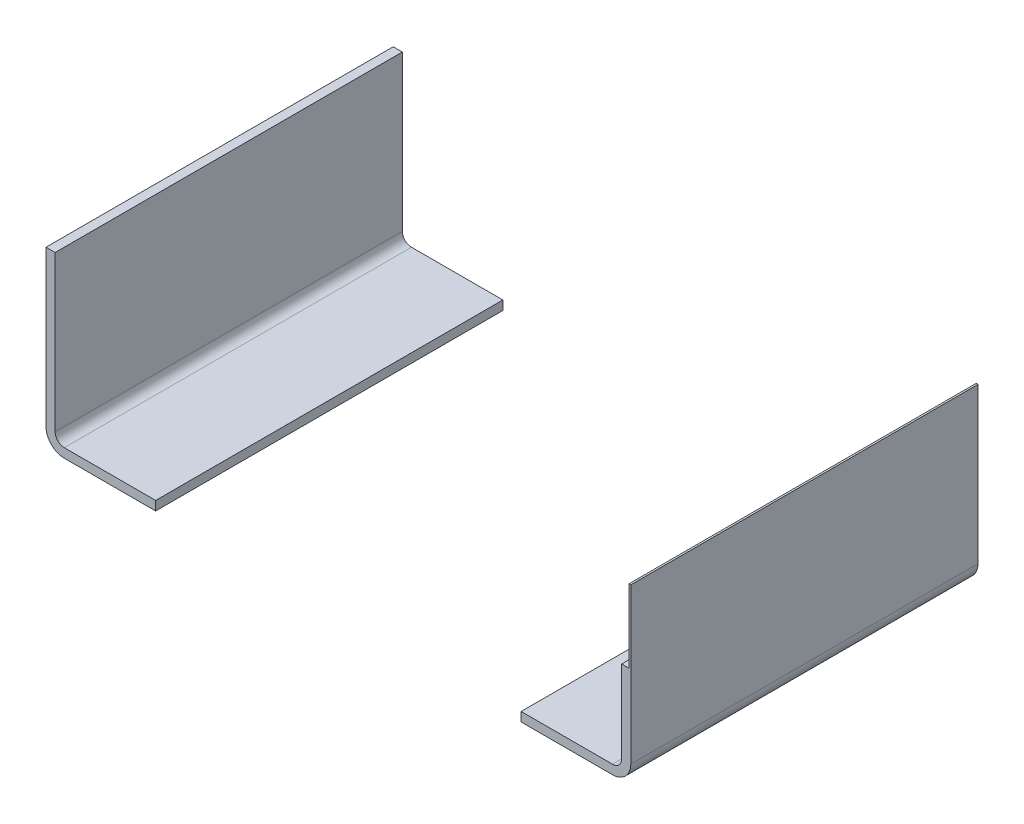
ISO-10303-21;
HEADER;
FILE_DESCRIPTION(('STEP AP214'),'2;1');
FILE_NAME('part.step','',(''),(''),'','','');
FILE_SCHEMA(('AUTOMOTIVE_DESIGN { 1 0 10303 214 1 1 1 1 }'));
ENDSEC;
DATA;
#1=APPLICATION_CONTEXT('core data for automotive mechanical design processes');
#2=APPLICATION_PROTOCOL_DEFINITION('international standard','automotive_design',2000,#1);
#3=PRODUCT_CONTEXT('',#1,'mechanical');
#4=PRODUCT('Part','Part','',(#3));
#5=PRODUCT_RELATED_PRODUCT_CATEGORY('part','',(#4));
#6=PRODUCT_DEFINITION_FORMATION('','',#4);
#7=PRODUCT_DEFINITION_CONTEXT('part definition',#1,'design');
#8=PRODUCT_DEFINITION('design','',#6,#7);
#9=PRODUCT_DEFINITION_SHAPE('','',#8);
#10=(LENGTH_UNIT() NAMED_UNIT(*) SI_UNIT(.MILLI.,.METRE.));
#11=(NAMED_UNIT(*) PLANE_ANGLE_UNIT() SI_UNIT($,.RADIAN.));
#12=(NAMED_UNIT(*) SI_UNIT($,.STERADIAN.) SOLID_ANGLE_UNIT());
#13=UNCERTAINTY_MEASURE_WITH_UNIT(LENGTH_MEASURE(1.E-05),#10,'distance_accuracy_value','');
#14=(GEOMETRIC_REPRESENTATION_CONTEXT(3) GLOBAL_UNCERTAINTY_ASSIGNED_CONTEXT((#13)) GLOBAL_UNIT_ASSIGNED_CONTEXT((#10,
#11,#12)) REPRESENTATION_CONTEXT('',''));
#15=CARTESIAN_POINT('',(0.,0.,0.));
#16=DIRECTION('',(0.,0.,1.));
#17=DIRECTION('',(1.,0.,0.));
#18=AXIS2_PLACEMENT_3D('',#15,#16,#17);
#19=CARTESIAN_POINT('',(1.6,0.95,0.95));
#20=DIRECTION('',(0.,0.,-1.));
#21=DIRECTION('',(-1.,0.,0.));
#22=AXIS2_PLACEMENT_3D('',#19,#20,#21);
#23=PLANE('',#22);
#24=DIRECTION('',(1.,0.,0.));
#25=VECTOR('',#24,1.);
#26=CARTESIAN_POINT('',(1.6,0.55,0.95));
#27=LINE('',#26,#25);
#28=CARTESIAN_POINT('',(1.55,0.55,0.95));
#29=VERTEX_POINT('',#28);
#30=CARTESIAN_POINT('',(1.59,0.55,0.95));
#31=VERTEX_POINT('',#30);
#32=EDGE_CURVE('P0_E198',#29,#31,#27,.T.);
#33=ORIENTED_EDGE('',*,*,#32,.F.);
#34=DIRECTION('',(0.,1.,0.));
#35=VECTOR('',#34,1.);
#36=CARTESIAN_POINT('',(1.55,0.95,0.95));
#37=LINE('',#36,#35);
#38=CARTESIAN_POINT('',(1.55,0.1,0.95));
#39=VERTEX_POINT('',#38);
#40=EDGE_CURVE('P0_E176',#29,#39,#37,.F.);
#41=ORIENTED_EDGE('',*,*,#40,.T.);
#42=CARTESIAN_POINT('',(1.5,0.1,0.95));
#43=DIRECTION('',(0.,0.,1.));
#44=DIRECTION('',(1.,0.,0.));
#45=AXIS2_PLACEMENT_3D('',#42,#43,#44);
#46=CIRCLE('',#45,0.0499999999999999);
#47=CARTESIAN_POINT('',(1.5,0.0500000000000001,0.95));
#48=VERTEX_POINT('',#47);
#49=EDGE_CURVE('P0_E125',#39,#48,#46,.F.);
#50=ORIENTED_EDGE('',*,*,#49,.T.);
#51=DIRECTION('',(-1.,0.,0.));
#52=VECTOR('',#51,1.);
#53=CARTESIAN_POINT('',(1.6,0.05,0.95));
#54=LINE('',#53,#52);
#55=CARTESIAN_POINT('',(1.,0.05,0.95));
#56=VERTEX_POINT('',#55);
#57=EDGE_CURVE('P0_E126',#56,#48,#54,.F.);
#58=ORIENTED_EDGE('',*,*,#57,.F.);
#59=DIRECTION('',(0.,1.,0.));
#60=VECTOR('',#59,1.);
#61=CARTESIAN_POINT('',(1.,0.,0.95));
#62=LINE('',#61,#60);
#63=CARTESIAN_POINT('',(1.,0.,0.95));
#64=VERTEX_POINT('',#63);
#65=EDGE_CURVE('P0_E102',#64,#56,#62,.T.);
#66=ORIENTED_EDGE('',*,*,#65,.F.);
#67=DIRECTION('',(1.,0.,0.));
#68=VECTOR('',#67,1.);
#69=CARTESIAN_POINT('',(1.5,0.,0.95));
#70=LINE('',#69,#68);
#71=CARTESIAN_POINT('',(1.5,0.,0.95));
#72=VERTEX_POINT('',#71);
#73=EDGE_CURVE('P0_E84',#64,#72,#70,.T.);
#74=ORIENTED_EDGE('',*,*,#73,.T.);
#75=CARTESIAN_POINT('',(1.5,0.1,0.95));
#76=DIRECTION('',(0.,0.,1.));
#77=DIRECTION('',(1.,0.,0.));
#78=AXIS2_PLACEMENT_3D('',#75,#76,#77);
#79=CIRCLE('',#78,0.1);
#80=CARTESIAN_POINT('',(1.6,0.1,0.95));
#81=VERTEX_POINT('',#80);
#82=EDGE_CURVE('P0_E20',#81,#72,#79,.F.);
#83=ORIENTED_EDGE('',*,*,#82,.F.);
#84=DIRECTION('',(0.,1.,0.));
#85=VECTOR('',#84,1.);
#86=CARTESIAN_POINT('',(1.6,0.95,0.95));
#87=LINE('',#86,#85);
#88=CARTESIAN_POINT('',(1.6,0.95,0.95));
#89=VERTEX_POINT('',#88);
#90=EDGE_CURVE('P0_E148',#81,#89,#87,.T.);
#91=ORIENTED_EDGE('',*,*,#90,.T.);
#92=DIRECTION('',(-1.,0.,0.));
#93=VECTOR('',#92,1.);
#94=CARTESIAN_POINT('',(1.6,0.95,0.95));
#95=LINE('',#94,#93);
#96=CARTESIAN_POINT('',(1.59,0.95,0.95));
#97=VERTEX_POINT('',#96);
#98=EDGE_CURVE('P0_E121',#97,#89,#95,.F.);
#99=ORIENTED_EDGE('',*,*,#98,.F.);
#100=DIRECTION('',(0.,-1.,0.));
#101=VECTOR('',#100,1.);
#102=CARTESIAN_POINT('',(1.59,0.95,0.95));
#103=LINE('',#102,#101);
#104=EDGE_CURVE('P0_E92',#97,#31,#103,.T.);
#105=ORIENTED_EDGE('',*,*,#104,.T.);
#106=EDGE_LOOP('',(#33,#41,#50,#58,#66,#74,#83,#91,#99,#105));
#107=FACE_BOUND('',#106,.T.);
#108=ADVANCED_FACE('P0_F16',(#107),#23,.F.);
#109=CARTESIAN_POINT('',(1.55,0.95,-0.95));
#110=DIRECTION('',(0.,0.,1.));
#111=DIRECTION('',(1.,0.,0.));
#112=AXIS2_PLACEMENT_3D('',#109,#110,#111);
#113=PLANE('',#112);
#114=DIRECTION('',(-1.,0.,0.));
#115=VECTOR('',#114,1.);
#116=CARTESIAN_POINT('',(1.55,0.55,-0.95));
#117=LINE('',#116,#115);
#118=CARTESIAN_POINT('',(1.59,0.55,-0.95));
#119=VERTEX_POINT('',#118);
#120=CARTESIAN_POINT('',(1.55,0.55,-0.95));
#121=VERTEX_POINT('',#120);
#122=EDGE_CURVE('P0_E35',#119,#121,#117,.T.);
#123=ORIENTED_EDGE('',*,*,#122,.F.);
#124=DIRECTION('',(0.,1.,0.));
#125=VECTOR('',#124,1.);
#126=CARTESIAN_POINT('',(1.59,0.95,-0.95));
#127=LINE('',#126,#125);
#128=CARTESIAN_POINT('',(1.59,0.95,-0.95));
#129=VERTEX_POINT('',#128);
#130=EDGE_CURVE('P0_E11',#119,#129,#127,.T.);
#131=ORIENTED_EDGE('',*,*,#130,.T.);
#132=DIRECTION('',(1.,0.,0.));
#133=VECTOR('',#132,1.);
#134=CARTESIAN_POINT('',(1.55,0.95,-0.95));
#135=LINE('',#134,#133);
#136=CARTESIAN_POINT('',(1.6,0.95,-0.95));
#137=VERTEX_POINT('',#136);
#138=EDGE_CURVE('P0_E137',#137,#129,#135,.F.);
#139=ORIENTED_EDGE('',*,*,#138,.F.);
#140=DIRECTION('',(0.,1.,0.));
#141=VECTOR('',#140,1.);
#142=CARTESIAN_POINT('',(1.6,0.95,-0.95));
#143=LINE('',#142,#141);
#144=CARTESIAN_POINT('',(1.6,0.1,-0.95));
#145=VERTEX_POINT('',#144);
#146=EDGE_CURVE('P0_E101',#137,#145,#143,.F.);
#147=ORIENTED_EDGE('',*,*,#146,.T.);
#148=CARTESIAN_POINT('',(1.5,0.1,-0.95));
#149=DIRECTION('',(0.,0.,1.));
#150=DIRECTION('',(1.,0.,0.));
#151=AXIS2_PLACEMENT_3D('',#148,#149,#150);
#152=CIRCLE('',#151,0.1);
#153=CARTESIAN_POINT('',(1.5,0.,-0.95));
#154=VERTEX_POINT('',#153);
#155=EDGE_CURVE('P0_E90',#154,#145,#152,.T.);
#156=ORIENTED_EDGE('',*,*,#155,.F.);
#157=DIRECTION('',(1.,0.,0.));
#158=VECTOR('',#157,1.);
#159=CARTESIAN_POINT('',(1.5,0.,-0.95));
#160=LINE('',#159,#158);
#161=CARTESIAN_POINT('',(1.,0.,-0.95));
#162=VERTEX_POINT('',#161);
#163=EDGE_CURVE('P0_E87',#154,#162,#160,.F.);
#164=ORIENTED_EDGE('',*,*,#163,.T.);
#165=DIRECTION('',(0.,1.,0.));
#166=VECTOR('',#165,1.);
#167=CARTESIAN_POINT('',(1.,0.,-0.95));
#168=LINE('',#167,#166);
#169=CARTESIAN_POINT('',(1.,0.05,-0.95));
#170=VERTEX_POINT('',#169);
#171=EDGE_CURVE('P0_E74',#170,#162,#168,.F.);
#172=ORIENTED_EDGE('',*,*,#171,.F.);
#173=DIRECTION('',(1.,0.,0.));
#174=VECTOR('',#173,1.);
#175=CARTESIAN_POINT('',(1.5,0.05,-0.95));
#176=LINE('',#175,#174);
#177=CARTESIAN_POINT('',(1.5,0.0500000000000001,-0.95));
#178=VERTEX_POINT('',#177);
#179=EDGE_CURVE('P0_E141',#170,#178,#176,.T.);
#180=ORIENTED_EDGE('',*,*,#179,.T.);
#181=CARTESIAN_POINT('',(1.5,0.1,-0.95));
#182=DIRECTION('',(0.,0.,1.));
#183=DIRECTION('',(1.,0.,0.));
#184=AXIS2_PLACEMENT_3D('',#181,#182,#183);
#185=CIRCLE('',#184,0.0499999999999999);
#186=CARTESIAN_POINT('',(1.55,0.1,-0.95));
#187=VERTEX_POINT('',#186);
#188=EDGE_CURVE('P0_E127',#187,#178,#185,.F.);
#189=ORIENTED_EDGE('',*,*,#188,.F.);
#190=DIRECTION('',(0.,1.,0.));
#191=VECTOR('',#190,1.);
#192=CARTESIAN_POINT('',(1.55,0.95,-0.95));
#193=LINE('',#192,#191);
#194=EDGE_CURVE('P0_E119',#187,#121,#193,.T.);
#195=ORIENTED_EDGE('',*,*,#194,.T.);
#196=EDGE_LOOP('',(#123,#131,#139,#147,#156,#164,#172,#180,#189,#195));
#197=FACE_BOUND('',#196,.T.);
#198=ADVANCED_FACE('P0_F88',(#197),#113,.F.);
#199=CARTESIAN_POINT('',(1.55,0.95,1.1));
#200=DIRECTION('',(1.,0.,0.));
#201=DIRECTION('',(0.,0.,-1.));
#202=AXIS2_PLACEMENT_3D('',#199,#200,#201);
#203=PLANE('',#202);
#204=DIRECTION('',(0.,0.,1.));
#205=VECTOR('',#204,1.);
#206=CARTESIAN_POINT('',(1.55,0.55,1.1));
#207=LINE('',#206,#205);
#208=EDGE_CURVE('P0_E26',#121,#29,#207,.T.);
#209=ORIENTED_EDGE('',*,*,#208,.F.);
#210=ORIENTED_EDGE('',*,*,#194,.F.);
#211=DIRECTION('',(0.,0.,-1.));
#212=VECTOR('',#211,1.);
#213=CARTESIAN_POINT('',(1.55,0.1,1.1));
#214=LINE('',#213,#212);
#215=EDGE_CURVE('P0_E182',#39,#187,#214,.T.);
#216=ORIENTED_EDGE('',*,*,#215,.F.);
#217=ORIENTED_EDGE('',*,*,#40,.F.);
#218=EDGE_LOOP('',(#209,#210,#216,#217));
#219=FACE_BOUND('',#218,.T.);
#220=ADVANCED_FACE('P0_F200',(#219),#203,.F.);
#221=CARTESIAN_POINT('',(1.5,0.,0.));
#222=DIRECTION('',(0.,1.,0.));
#223=DIRECTION('',(0.,0.,1.));
#224=AXIS2_PLACEMENT_3D('',#221,#222,#223);
#225=PLANE('',#224);
#226=DIRECTION('',(0.,0.,1.));
#227=VECTOR('',#226,1.);
#228=CARTESIAN_POINT('',(1.,0.,0.));
#229=LINE('',#228,#227);
#230=EDGE_CURVE('P0_E97',#162,#64,#229,.T.);
#231=ORIENTED_EDGE('',*,*,#230,.F.);
#232=ORIENTED_EDGE('',*,*,#163,.F.);
#233=DIRECTION('',(0.,0.,1.));
#234=VECTOR('',#233,1.);
#235=CARTESIAN_POINT('',(1.5,0.,0.55));
#236=LINE('',#235,#234);
#237=EDGE_CURVE('P0_E106',#72,#154,#236,.F.);
#238=ORIENTED_EDGE('',*,*,#237,.F.);
#239=ORIENTED_EDGE('',*,*,#73,.F.);
#240=EDGE_LOOP('',(#231,#232,#238,#239));
#241=FACE_BOUND('',#240,.T.);
#242=ADVANCED_FACE('P0_F18',(#241),#225,.F.);
#243=CARTESIAN_POINT('',(1.5,0.1,0.55));
#244=DIRECTION('',(0.,0.,1.));
#245=DIRECTION('',(1.,0.,0.));
#246=AXIS2_PLACEMENT_3D('',#243,#244,#245);
#247=CYLINDRICAL_SURFACE('',#246,0.1);
#248=ORIENTED_EDGE('',*,*,#237,.T.);
#249=ORIENTED_EDGE('',*,*,#155,.T.);
#250=DIRECTION('',(0.,0.,1.));
#251=VECTOR('',#250,1.);
#252=CARTESIAN_POINT('',(1.6,0.1,0.));
#253=LINE('',#252,#251);
#254=EDGE_CURVE('P0_E109',#145,#81,#253,.T.);
#255=ORIENTED_EDGE('',*,*,#254,.T.);
#256=ORIENTED_EDGE('',*,*,#82,.T.);
#257=EDGE_LOOP('',(#248,#249,#255,#256));
#258=FACE_BOUND('',#257,.T.);
#259=ADVANCED_FACE('P0_F163',(#258),#247,.T.);
#260=CARTESIAN_POINT('',(1.,0.,0.));
#261=DIRECTION('',(-1.,0.,0.));
#262=DIRECTION('',(0.,0.,1.));
#263=AXIS2_PLACEMENT_3D('',#260,#261,#262);
#264=PLANE('',#263);
#265=DIRECTION('',(0.,0.,-1.));
#266=VECTOR('',#265,1.);
#267=CARTESIAN_POINT('',(1.,0.05,1.1));
#268=LINE('',#267,#266);
#269=EDGE_CURVE('P0_E100',#56,#170,#268,.T.);
#270=ORIENTED_EDGE('',*,*,#269,.T.);
#271=ORIENTED_EDGE('',*,*,#171,.T.);
#272=ORIENTED_EDGE('',*,*,#230,.T.);
#273=ORIENTED_EDGE('',*,*,#65,.T.);
#274=EDGE_LOOP('',(#270,#271,#272,#273));
#275=FACE_BOUND('',#274,.T.);
#276=ADVANCED_FACE('P0_F96',(#275),#264,.T.);
#277=CARTESIAN_POINT('',(1.6,0.95,0.));
#278=DIRECTION('',(-1.,0.,0.));
#279=DIRECTION('',(0.,0.,1.));
#280=AXIS2_PLACEMENT_3D('',#277,#278,#279);
#281=PLANE('',#280);
#282=ORIENTED_EDGE('',*,*,#254,.F.);
#283=ORIENTED_EDGE('',*,*,#146,.F.);
#284=DIRECTION('',(0.,0.,-1.));
#285=VECTOR('',#284,1.);
#286=CARTESIAN_POINT('',(1.6,0.95,0.));
#287=LINE('',#286,#285);
#288=EDGE_CURVE('P0_E138',#137,#89,#287,.F.);
#289=ORIENTED_EDGE('',*,*,#288,.T.);
#290=ORIENTED_EDGE('',*,*,#90,.F.);
#291=EDGE_LOOP('',(#282,#283,#289,#290));
#292=FACE_BOUND('',#291,.T.);
#293=ADVANCED_FACE('P0_F166',(#292),#281,.F.);
#294=CARTESIAN_POINT('',(1.5,0.05,1.1));
#295=DIRECTION('',(0.,-1.,0.));
#296=DIRECTION('',(0.,0.,-1.));
#297=AXIS2_PLACEMENT_3D('',#294,#295,#296);
#298=PLANE('',#297);
#299=ORIENTED_EDGE('',*,*,#269,.F.);
#300=ORIENTED_EDGE('',*,*,#57,.T.);
#301=DIRECTION('',(0.,0.,1.));
#302=VECTOR('',#301,1.);
#303=CARTESIAN_POINT('',(1.5,0.0500000000000001,0.));
#304=LINE('',#303,#302);
#305=EDGE_CURVE('P0_E134',#48,#178,#304,.F.);
#306=ORIENTED_EDGE('',*,*,#305,.T.);
#307=ORIENTED_EDGE('',*,*,#179,.F.);
#308=EDGE_LOOP('',(#299,#300,#306,#307));
#309=FACE_BOUND('',#308,.T.);
#310=ADVANCED_FACE('P0_F186',(#309),#298,.F.);
#311=CARTESIAN_POINT('',(1.575,0.95,0.));
#312=DIRECTION('',(0.,-1.,0.));
#313=DIRECTION('',(0.,0.,-1.));
#314=AXIS2_PLACEMENT_3D('',#311,#312,#313);
#315=PLANE('',#314);
#316=ORIENTED_EDGE('',*,*,#138,.T.);
#317=DIRECTION('',(0.,0.,1.));
#318=VECTOR('',#317,1.);
#319=CARTESIAN_POINT('',(1.59,0.95,0.));
#320=LINE('',#319,#318);
#321=EDGE_CURVE('P0_E214',#129,#97,#320,.T.);
#322=ORIENTED_EDGE('',*,*,#321,.T.);
#323=ORIENTED_EDGE('',*,*,#98,.T.);
#324=ORIENTED_EDGE('',*,*,#288,.F.);
#325=EDGE_LOOP('',(#316,#322,#323,#324));
#326=FACE_BOUND('',#325,.T.);
#327=ADVANCED_FACE('P0_F213',(#326),#315,.F.);
#328=CARTESIAN_POINT('',(1.5,0.1,0.));
#329=DIRECTION('',(0.,0.,1.));
#330=DIRECTION('',(1.,0.,0.));
#331=AXIS2_PLACEMENT_3D('',#328,#329,#330);
#332=CYLINDRICAL_SURFACE('',#331,0.0499999999999999);
#333=ORIENTED_EDGE('',*,*,#305,.F.);
#334=ORIENTED_EDGE('',*,*,#49,.F.);
#335=ORIENTED_EDGE('',*,*,#215,.T.);
#336=ORIENTED_EDGE('',*,*,#188,.T.);
#337=EDGE_LOOP('',(#333,#334,#335,#336));
#338=FACE_BOUND('',#337,.T.);
#339=ADVANCED_FACE('P0_F190',(#338),#332,.F.);
#340=CARTESIAN_POINT('',(1.59,0.95,1.4));
#341=DIRECTION('',(1.,0.,0.));
#342=DIRECTION('',(0.,0.,-1.));
#343=AXIS2_PLACEMENT_3D('',#340,#341,#342);
#344=PLANE('',#343);
#345=ORIENTED_EDGE('',*,*,#321,.F.);
#346=ORIENTED_EDGE('',*,*,#130,.F.);
#347=DIRECTION('',(0.,0.,-1.));
#348=VECTOR('',#347,1.);
#349=CARTESIAN_POINT('',(1.59,0.55,1.4));
#350=LINE('',#349,#348);
#351=EDGE_CURVE('P0_E220',#31,#119,#350,.T.);
#352=ORIENTED_EDGE('',*,*,#351,.F.);
#353=ORIENTED_EDGE('',*,*,#104,.F.);
#354=EDGE_LOOP('',(#345,#346,#352,#353));
#355=FACE_BOUND('',#354,.T.);
#356=ADVANCED_FACE('P0_F226',(#355),#344,.F.);
#357=CARTESIAN_POINT('',(0.,0.55,0.));
#358=DIRECTION('',(0.,1.,0.));
#359=DIRECTION('',(0.,0.,1.));
#360=AXIS2_PLACEMENT_3D('',#357,#358,#359);
#361=PLANE('',#360);
#362=ORIENTED_EDGE('',*,*,#32,.T.);
#363=ORIENTED_EDGE('',*,*,#351,.T.);
#364=ORIENTED_EDGE('',*,*,#122,.T.);
#365=ORIENTED_EDGE('',*,*,#208,.T.);
#366=EDGE_LOOP('',(#362,#363,#364,#365));
#367=FACE_BOUND('',#366,.T.);
#368=ADVANCED_FACE('P0_F225',(#367),#361,.T.);
#369=CLOSED_SHELL('',(#108,#198,#220,#242,#259,#276,#293,#310,#327,#339,#356,#368));
#370=MANIFOLD_SOLID_BREP('P0_B1',#369);
#371=CARTESIAN_POINT('',(-1.5,0.,0.));
#372=DIRECTION('',(0.,-1.,0.));
#373=DIRECTION('',(0.,0.,-1.));
#374=AXIS2_PLACEMENT_3D('',#371,#372,#373);
#375=PLANE('',#374);
#376=DIRECTION('',(0.,0.,1.));
#377=VECTOR('',#376,1.);
#378=CARTESIAN_POINT('',(-1.,0.,0.));
#379=LINE('',#378,#377);
#380=CARTESIAN_POINT('',(-1.,0.,-0.95));
#381=VERTEX_POINT('',#380);
#382=CARTESIAN_POINT('',(-1.,0.,0.950000000000001));
#383=VERTEX_POINT('',#382);
#384=EDGE_CURVE('P1_E153',#381,#383,#379,.T.);
#385=ORIENTED_EDGE('',*,*,#384,.T.);
#386=DIRECTION('',(1.,0.,0.));
#387=VECTOR('',#386,1.);
#388=CARTESIAN_POINT('',(-1.5,0.,0.950000000000001));
#389=LINE('',#388,#387);
#390=CARTESIAN_POINT('',(-1.5,0.,0.950000000000001));
#391=VERTEX_POINT('',#390);
#392=EDGE_CURVE('P1_E69',#383,#391,#389,.F.);
#393=ORIENTED_EDGE('',*,*,#392,.T.);
#394=DIRECTION('',(0.,0.,-1.));
#395=VECTOR('',#394,1.);
#396=CARTESIAN_POINT('',(-1.5,0.,0.55));
#397=LINE('',#396,#395);
#398=CARTESIAN_POINT('',(-1.5,0.,-0.95));
#399=VERTEX_POINT('',#398);
#400=EDGE_CURVE('P1_E173',#399,#391,#397,.F.);
#401=ORIENTED_EDGE('',*,*,#400,.F.);
#402=DIRECTION('',(1.,0.,0.));
#403=VECTOR('',#402,1.);
#404=CARTESIAN_POINT('',(-1.5,0.,-0.95));
#405=LINE('',#404,#403);
#406=EDGE_CURVE('P1_E166',#399,#381,#405,.T.);
#407=ORIENTED_EDGE('',*,*,#406,.T.);
#408=EDGE_LOOP('',(#385,#393,#401,#407));
#409=FACE_BOUND('',#408,.T.);
#410=ADVANCED_FACE('P1_F16',(#409),#375,.T.);
#411=CARTESIAN_POINT('',(-1.5,0.1,0.55));
#412=DIRECTION('',(0.,0.,-1.));
#413=DIRECTION('',(-1.,0.,0.));
#414=AXIS2_PLACEMENT_3D('',#411,#412,#413);
#415=CYLINDRICAL_SURFACE('',#414,0.1);
#416=ORIENTED_EDGE('',*,*,#400,.T.);
#417=CARTESIAN_POINT('',(-1.5,0.1,0.950000000000001));
#418=DIRECTION('',(0.,0.,-1.));
#419=DIRECTION('',(-1.,0.,0.));
#420=AXIS2_PLACEMENT_3D('',#417,#418,#419);
#421=CIRCLE('',#420,0.1);
#422=CARTESIAN_POINT('',(-1.6,0.1,0.950000000000001));
#423=VERTEX_POINT('',#422);
#424=EDGE_CURVE('P1_E163',#391,#423,#421,.T.);
#425=ORIENTED_EDGE('',*,*,#424,.T.);
#426=DIRECTION('',(0.,0.,1.));
#427=VECTOR('',#426,1.);
#428=CARTESIAN_POINT('',(-1.6,0.1,0.));
#429=LINE('',#428,#427);
#430=CARTESIAN_POINT('',(-1.6,0.1,-0.95));
#431=VERTEX_POINT('',#430);
#432=EDGE_CURVE('P1_E144',#431,#423,#429,.T.);
#433=ORIENTED_EDGE('',*,*,#432,.F.);
#434=CARTESIAN_POINT('',(-1.5,0.1,-0.95));
#435=DIRECTION('',(0.,0.,-1.));
#436=DIRECTION('',(-1.,0.,0.));
#437=AXIS2_PLACEMENT_3D('',#434,#435,#436);
#438=CIRCLE('',#437,0.1);
#439=EDGE_CURVE('P1_E19',#431,#399,#438,.F.);
#440=ORIENTED_EDGE('',*,*,#439,.T.);
#441=EDGE_LOOP('',(#416,#425,#433,#440));
#442=FACE_BOUND('',#441,.T.);
#443=ADVANCED_FACE('P1_F179',(#442),#415,.T.);
#444=CARTESIAN_POINT('',(-1.,0.,0.));
#445=DIRECTION('',(-1.,0.,0.));
#446=DIRECTION('',(0.,0.,1.));
#447=AXIS2_PLACEMENT_3D('',#444,#445,#446);
#448=PLANE('',#447);
#449=DIRECTION('',(0.,0.,1.));
#450=VECTOR('',#449,1.);
#451=CARTESIAN_POINT('',(-1.,0.05,1.1));
#452=LINE('',#451,#450);
#453=CARTESIAN_POINT('',(-1.,0.05,0.950000000000001));
#454=VERTEX_POINT('',#453);
#455=CARTESIAN_POINT('',(-1.,0.05,-0.95));
#456=VERTEX_POINT('',#455);
#457=EDGE_CURVE('P1_E135',#454,#456,#452,.F.);
#458=ORIENTED_EDGE('',*,*,#457,.F.);
#459=DIRECTION('',(0.,1.,0.));
#460=VECTOR('',#459,1.);
#461=CARTESIAN_POINT('',(-1.,0.,0.950000000000001));
#462=LINE('',#461,#460);
#463=EDGE_CURVE('P1_E151',#383,#454,#462,.T.);
#464=ORIENTED_EDGE('',*,*,#463,.F.);
#465=ORIENTED_EDGE('',*,*,#384,.F.);
#466=DIRECTION('',(0.,1.,0.));
#467=VECTOR('',#466,1.);
#468=CARTESIAN_POINT('',(-1.,0.,-0.95));
#469=LINE('',#468,#467);
#470=EDGE_CURVE('P1_E145',#456,#381,#469,.F.);
#471=ORIENTED_EDGE('',*,*,#470,.F.);
#472=EDGE_LOOP('',(#458,#464,#465,#471));
#473=FACE_BOUND('',#472,.T.);
#474=ADVANCED_FACE('P1_F186',(#473),#448,.F.);
#475=CARTESIAN_POINT('',(-1.6,0.95,0.));
#476=DIRECTION('',(-1.,0.,0.));
#477=DIRECTION('',(0.,0.,1.));
#478=AXIS2_PLACEMENT_3D('',#475,#476,#477);
#479=PLANE('',#478);
#480=ORIENTED_EDGE('',*,*,#432,.T.);
#481=DIRECTION('',(0.,1.,0.));
#482=VECTOR('',#481,1.);
#483=CARTESIAN_POINT('',(-1.6,0.95,0.950000000000001));
#484=LINE('',#483,#482);
#485=CARTESIAN_POINT('',(-1.6,0.95,0.950000000000001));
#486=VERTEX_POINT('',#485);
#487=EDGE_CURVE('P1_E140',#423,#486,#484,.T.);
#488=ORIENTED_EDGE('',*,*,#487,.T.);
#489=DIRECTION('',(0.,0.,1.));
#490=VECTOR('',#489,1.);
#491=CARTESIAN_POINT('',(-1.6,0.95,0.));
#492=LINE('',#491,#490);
#493=CARTESIAN_POINT('',(-1.6,0.95,-0.95));
#494=VERTEX_POINT('',#493);
#495=EDGE_CURVE('P1_E121',#494,#486,#492,.T.);
#496=ORIENTED_EDGE('',*,*,#495,.F.);
#497=DIRECTION('',(0.,1.,0.));
#498=VECTOR('',#497,1.);
#499=CARTESIAN_POINT('',(-1.6,0.95,-0.95));
#500=LINE('',#499,#498);
#501=EDGE_CURVE('P1_E102',#494,#431,#500,.F.);
#502=ORIENTED_EDGE('',*,*,#501,.T.);
#503=EDGE_LOOP('',(#480,#488,#496,#502));
#504=FACE_BOUND('',#503,.T.);
#505=ADVANCED_FACE('P1_F183',(#504),#479,.T.);
#506=CARTESIAN_POINT('',(-1.5,0.05,1.1));
#507=DIRECTION('',(0.,1.,0.));
#508=DIRECTION('',(0.,0.,1.));
#509=AXIS2_PLACEMENT_3D('',#506,#507,#508);
#510=PLANE('',#509);
#511=ORIENTED_EDGE('',*,*,#457,.T.);
#512=DIRECTION('',(1.,0.,0.));
#513=VECTOR('',#512,1.);
#514=CARTESIAN_POINT('',(-1.5,0.05,-0.95));
#515=LINE('',#514,#513);
#516=CARTESIAN_POINT('',(-1.5,0.05,-0.95));
#517=VERTEX_POINT('',#516);
#518=EDGE_CURVE('P1_E129',#456,#517,#515,.F.);
#519=ORIENTED_EDGE('',*,*,#518,.T.);
#520=DIRECTION('',(0.,0.,-1.));
#521=VECTOR('',#520,1.);
#522=CARTESIAN_POINT('',(-1.5,0.0500000000000001,0.));
#523=LINE('',#522,#521);
#524=CARTESIAN_POINT('',(-1.5,0.0500000000000001,0.950000000000001));
#525=VERTEX_POINT('',#524);
#526=EDGE_CURVE('P1_E125',#517,#525,#523,.F.);
#527=ORIENTED_EDGE('',*,*,#526,.T.);
#528=DIRECTION('',(1.,0.,0.));
#529=VECTOR('',#528,1.);
#530=CARTESIAN_POINT('',(-1.6,0.05,0.950000000000001));
#531=LINE('',#530,#529);
#532=EDGE_CURVE('P1_E118',#454,#525,#531,.F.);
#533=ORIENTED_EDGE('',*,*,#532,.F.);
#534=EDGE_LOOP('',(#511,#519,#527,#533));
#535=FACE_BOUND('',#534,.T.);
#536=ADVANCED_FACE('P1_F185',(#535),#510,.T.);
#537=CARTESIAN_POINT('',(-1.575,0.95,0.));
#538=DIRECTION('',(0.,1.,0.));
#539=DIRECTION('',(0.,0.,1.));
#540=AXIS2_PLACEMENT_3D('',#537,#538,#539);
#541=PLANE('',#540);
#542=ORIENTED_EDGE('',*,*,#495,.T.);
#543=DIRECTION('',(1.,0.,0.));
#544=VECTOR('',#543,1.);
#545=CARTESIAN_POINT('',(-1.6,0.95,0.950000000000001));
#546=LINE('',#545,#544);
#547=CARTESIAN_POINT('',(-1.55,0.95,0.950000000000001));
#548=VERTEX_POINT('',#547);
#549=EDGE_CURVE('P1_E93',#548,#486,#546,.F.);
#550=ORIENTED_EDGE('',*,*,#549,.F.);
#551=DIRECTION('',(0.,0.,-1.));
#552=VECTOR('',#551,1.);
#553=CARTESIAN_POINT('',(-1.55,0.95,1.1));
#554=LINE('',#553,#552);
#555=CARTESIAN_POINT('',(-1.55,0.95,-0.95));
#556=VERTEX_POINT('',#555);
#557=EDGE_CURVE('P1_E87',#556,#548,#554,.F.);
#558=ORIENTED_EDGE('',*,*,#557,.F.);
#559=DIRECTION('',(-1.,0.,0.));
#560=VECTOR('',#559,1.);
#561=CARTESIAN_POINT('',(-1.55,0.95,-0.95));
#562=LINE('',#561,#560);
#563=EDGE_CURVE('P1_E91',#494,#556,#562,.F.);
#564=ORIENTED_EDGE('',*,*,#563,.F.);
#565=EDGE_LOOP('',(#542,#550,#558,#564));
#566=FACE_BOUND('',#565,.T.);
#567=ADVANCED_FACE('P1_F90',(#566),#541,.T.);
#568=CARTESIAN_POINT('',(-1.6,0.95,0.950000000000001));
#569=DIRECTION('',(0.,0.,1.));
#570=DIRECTION('',(1.,0.,0.));
#571=AXIS2_PLACEMENT_3D('',#568,#569,#570);
#572=PLANE('',#571);
#573=DIRECTION('',(0.,1.,0.));
#574=VECTOR('',#573,1.);
#575=CARTESIAN_POINT('',(-1.55,0.95,0.950000000000001));
#576=LINE('',#575,#574);
#577=CARTESIAN_POINT('',(-1.55,0.1,0.950000000000001));
#578=VERTEX_POINT('',#577);
#579=EDGE_CURVE('P1_E97',#548,#578,#576,.F.);
#580=ORIENTED_EDGE('',*,*,#579,.F.);
#581=ORIENTED_EDGE('',*,*,#549,.T.);
#582=ORIENTED_EDGE('',*,*,#487,.F.);
#583=ORIENTED_EDGE('',*,*,#424,.F.);
#584=ORIENTED_EDGE('',*,*,#392,.F.);
#585=ORIENTED_EDGE('',*,*,#463,.T.);
#586=ORIENTED_EDGE('',*,*,#532,.T.);
#587=CARTESIAN_POINT('',(-1.5,0.1,0.950000000000001));
#588=DIRECTION('',(0.,0.,-1.));
#589=DIRECTION('',(-1.,0.,0.));
#590=AXIS2_PLACEMENT_3D('',#587,#588,#589);
#591=CIRCLE('',#590,0.0499999999999999);
#592=EDGE_CURVE('P1_E133',#525,#578,#591,.T.);
#593=ORIENTED_EDGE('',*,*,#592,.T.);
#594=EDGE_LOOP('',(#580,#581,#582,#583,#584,#585,#586,#593));
#595=FACE_BOUND('',#594,.T.);
#596=ADVANCED_FACE('P1_F181',(#595),#572,.T.);
#597=CARTESIAN_POINT('',(-1.5,0.1,0.));
#598=DIRECTION('',(0.,0.,-1.));
#599=DIRECTION('',(-1.,0.,0.));
#600=AXIS2_PLACEMENT_3D('',#597,#598,#599);
#601=CYLINDRICAL_SURFACE('',#600,0.0499999999999999);
#602=ORIENTED_EDGE('',*,*,#526,.F.);
#603=CARTESIAN_POINT('',(-1.5,0.1,-0.95));
#604=DIRECTION('',(0.,0.,-1.));
#605=DIRECTION('',(-1.,0.,0.));
#606=AXIS2_PLACEMENT_3D('',#603,#604,#605);
#607=CIRCLE('',#606,0.0499999999999999);
#608=CARTESIAN_POINT('',(-1.55,0.1,-0.95));
#609=VERTEX_POINT('',#608);
#610=EDGE_CURVE('P1_E34',#609,#517,#607,.F.);
#611=ORIENTED_EDGE('',*,*,#610,.F.);
#612=DIRECTION('',(0.,0.,-1.));
#613=VECTOR('',#612,1.);
#614=CARTESIAN_POINT('',(-1.55,0.1,1.1));
#615=LINE('',#614,#613);
#616=EDGE_CURVE('P1_E25',#578,#609,#615,.T.);
#617=ORIENTED_EDGE('',*,*,#616,.F.);
#618=ORIENTED_EDGE('',*,*,#592,.F.);
#619=EDGE_LOOP('',(#602,#611,#617,#618));
#620=FACE_BOUND('',#619,.T.);
#621=ADVANCED_FACE('P1_F202',(#620),#601,.F.);
#622=CARTESIAN_POINT('',(-1.55,0.95,-0.95));
#623=DIRECTION('',(0.,0.,-1.));
#624=DIRECTION('',(-1.,0.,0.));
#625=AXIS2_PLACEMENT_3D('',#622,#623,#624);
#626=PLANE('',#625);
#627=ORIENTED_EDGE('',*,*,#501,.F.);
#628=ORIENTED_EDGE('',*,*,#563,.T.);
#629=DIRECTION('',(0.,1.,0.));
#630=VECTOR('',#629,1.);
#631=CARTESIAN_POINT('',(-1.55,0.95,-0.95));
#632=LINE('',#631,#630);
#633=EDGE_CURVE('P1_E11',#609,#556,#632,.T.);
#634=ORIENTED_EDGE('',*,*,#633,.F.);
#635=ORIENTED_EDGE('',*,*,#610,.T.);
#636=ORIENTED_EDGE('',*,*,#518,.F.);
#637=ORIENTED_EDGE('',*,*,#470,.T.);
#638=ORIENTED_EDGE('',*,*,#406,.F.);
#639=ORIENTED_EDGE('',*,*,#439,.F.);
#640=EDGE_LOOP('',(#627,#628,#634,#635,#636,#637,#638,#639));
#641=FACE_BOUND('',#640,.T.);
#642=ADVANCED_FACE('P1_F99',(#641),#626,.T.);
#643=CARTESIAN_POINT('',(-1.55,0.95,1.1));
#644=DIRECTION('',(1.,0.,0.));
#645=DIRECTION('',(0.,0.,-1.));
#646=AXIS2_PLACEMENT_3D('',#643,#644,#645);
#647=PLANE('',#646);
#648=ORIENTED_EDGE('',*,*,#616,.T.);
#649=ORIENTED_EDGE('',*,*,#633,.T.);
#650=ORIENTED_EDGE('',*,*,#557,.T.);
#651=ORIENTED_EDGE('',*,*,#579,.T.);
#652=EDGE_LOOP('',(#648,#649,#650,#651));
#653=FACE_BOUND('',#652,.T.);
#654=ADVANCED_FACE('P1_F105',(#653),#647,.T.);
#655=CLOSED_SHELL('',(#410,#443,#474,#505,#536,#567,#596,#621,#642,#654));
#656=MANIFOLD_SOLID_BREP('P1_B1',#655);
#657=ADVANCED_BREP_SHAPE_REPRESENTATION('',(#18,#370,#656),#14);
#658=SHAPE_DEFINITION_REPRESENTATION(#9,#657);
ENDSEC;
END-ISO-10303-21;
